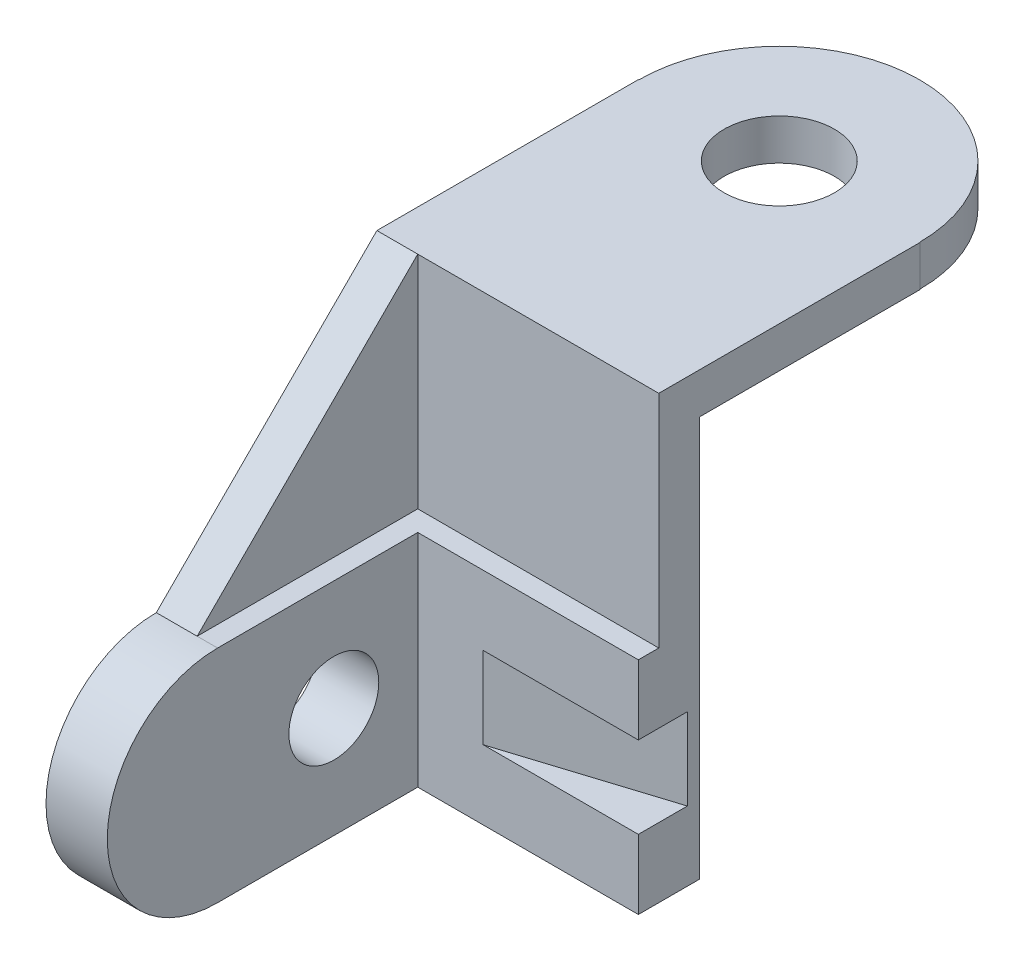
ISO-10303-21;
HEADER;
FILE_DESCRIPTION(('STEP AP214'),'2;1');
FILE_NAME('part.step','',(''),(''),'','','');
FILE_SCHEMA(('AUTOMOTIVE_DESIGN { 1 0 10303 214 1 1 1 1 }'));
ENDSEC;
DATA;
#1=APPLICATION_CONTEXT('core data for automotive mechanical design processes');
#2=APPLICATION_PROTOCOL_DEFINITION('international standard','automotive_design',2000,#1);
#3=PRODUCT_CONTEXT('',#1,'mechanical');
#4=PRODUCT('Part','Part','',(#3));
#5=PRODUCT_RELATED_PRODUCT_CATEGORY('part','',(#4));
#6=PRODUCT_DEFINITION_FORMATION('','',#4);
#7=PRODUCT_DEFINITION_CONTEXT('part definition',#1,'design');
#8=PRODUCT_DEFINITION('design','',#6,#7);
#9=PRODUCT_DEFINITION_SHAPE('','',#8);
#10=(LENGTH_UNIT() NAMED_UNIT(*) SI_UNIT(.MILLI.,.METRE.));
#11=(NAMED_UNIT(*) PLANE_ANGLE_UNIT() SI_UNIT($,.RADIAN.));
#12=(NAMED_UNIT(*) SI_UNIT($,.STERADIAN.) SOLID_ANGLE_UNIT());
#13=UNCERTAINTY_MEASURE_WITH_UNIT(LENGTH_MEASURE(1.E-05),#10,'distance_accuracy_value','');
#14=(GEOMETRIC_REPRESENTATION_CONTEXT(3) GLOBAL_UNCERTAINTY_ASSIGNED_CONTEXT((#13)) GLOBAL_UNIT_ASSIGNED_CONTEXT((#10,
#11,#12)) REPRESENTATION_CONTEXT('',''));
#15=CARTESIAN_POINT('',(0.,0.,0.));
#16=DIRECTION('',(0.,0.,1.));
#17=DIRECTION('',(1.,0.,0.));
#18=AXIS2_PLACEMENT_3D('',#15,#16,#17);
#19=CARTESIAN_POINT('',(31.,-17.,-7.));
#20=DIRECTION('',(0.,1.,0.));
#21=DIRECTION('',(0.,0.,1.));
#22=AXIS2_PLACEMENT_3D('',#19,#20,#21);
#23=PLANE('',#22);
#24=DIRECTION('',(0.953582665134142,0.,-0.301131367937097));
#25=VECTOR('',#24,1.);
#26=CARTESIAN_POINT('',(31.,-17.,5.));
#27=LINE('',#26,#25);
#28=CARTESIAN_POINT('',(31.,-17.,5.));
#29=VERTEX_POINT('',#28);
#30=CARTESIAN_POINT('',(69.,-17.,-7.));
#31=VERTEX_POINT('',#30);
#32=EDGE_CURVE('E170',#29,#31,#27,.T.);
#33=ORIENTED_EDGE('',*,*,#32,.T.);
#34=DIRECTION('',(0.,0.,1.));
#35=VECTOR('',#34,1.);
#36=CARTESIAN_POINT('',(69.,-17.,-7.));
#37=LINE('',#36,#35);
#38=CARTESIAN_POINT('',(69.,-17.,5.));
#39=VERTEX_POINT('',#38);
#40=EDGE_CURVE('E155',#31,#39,#37,.T.);
#41=ORIENTED_EDGE('',*,*,#40,.T.);
#42=DIRECTION('',(-1.,0.,0.));
#43=VECTOR('',#42,1.);
#44=CARTESIAN_POINT('',(31.,-17.,5.));
#45=LINE('',#44,#43);
#46=EDGE_CURVE('E171',#39,#29,#45,.T.);
#47=ORIENTED_EDGE('',*,*,#46,.T.);
#48=EDGE_LOOP('',(#33,#41,#47));
#49=FACE_BOUND('',#48,.T.);
#50=ADVANCED_FACE('F41',(#49),#23,.F.);
#51=CARTESIAN_POINT('',(31.,-37.,-7.));
#52=DIRECTION('',(0.,-1.,0.));
#53=DIRECTION('',(0.,0.,-1.));
#54=AXIS2_PLACEMENT_3D('',#51,#52,#53);
#55=PLANE('',#54);
#56=DIRECTION('',(0.953582665134142,0.,-0.301131367937097));
#57=VECTOR('',#56,1.);
#58=CARTESIAN_POINT('',(31.,-37.,5.));
#59=LINE('',#58,#57);
#60=CARTESIAN_POINT('',(31.,-37.,5.));
#61=VERTEX_POINT('',#60);
#62=CARTESIAN_POINT('',(69.,-37.,-7.));
#63=VERTEX_POINT('',#62);
#64=EDGE_CURVE('E57',#61,#63,#59,.T.);
#65=ORIENTED_EDGE('',*,*,#64,.F.);
#66=DIRECTION('',(1.,0.,0.));
#67=VECTOR('',#66,1.);
#68=CARTESIAN_POINT('',(31.,-37.,5.));
#69=LINE('',#68,#67);
#70=CARTESIAN_POINT('',(69.,-37.,5.));
#71=VERTEX_POINT('',#70);
#72=EDGE_CURVE('E184',#61,#71,#69,.T.);
#73=ORIENTED_EDGE('',*,*,#72,.T.);
#74=DIRECTION('',(0.,0.,1.));
#75=VECTOR('',#74,1.);
#76=CARTESIAN_POINT('',(69.,-37.,-7.));
#77=LINE('',#76,#75);
#78=EDGE_CURVE('E167',#63,#71,#77,.T.);
#79=ORIENTED_EDGE('',*,*,#78,.F.);
#80=EDGE_LOOP('',(#65,#73,#79));
#81=FACE_BOUND('',#80,.T.);
#82=ADVANCED_FACE('F390',(#81),#55,.F.);
#83=CARTESIAN_POINT('',(0.,0.,-64.));
#84=DIRECTION('',(0.,0.,-1.));
#85=DIRECTION('',(-1.,0.,0.));
#86=AXIS2_PLACEMENT_3D('',#83,#84,#85);
#87=PLANE('',#86);
#88=DIRECTION('',(0.,1.,0.));
#89=VECTOR('',#88,1.);
#90=CARTESIAN_POINT('',(0.104882418884351,44.,-64.));
#91=LINE('',#90,#89);
#92=CARTESIAN_POINT('',(0.104882418884351,44.,-64.));
#93=VERTEX_POINT('',#92);
#94=CARTESIAN_POINT('',(0.104882418884351,54.,-64.));
#95=VERTEX_POINT('',#94);
#96=EDGE_CURVE('E11',#93,#95,#91,.T.);
#97=ORIENTED_EDGE('',*,*,#96,.F.);
#98=DIRECTION('',(-1.,0.,0.));
#99=VECTOR('',#98,1.);
#100=CARTESIAN_POINT('',(69.,44.,-64.));
#101=LINE('',#100,#99);
#102=CARTESIAN_POINT('',(0.,44.,-64.));
#103=VERTEX_POINT('',#102);
#104=EDGE_CURVE('E210',#93,#103,#101,.T.);
#105=ORIENTED_EDGE('',*,*,#104,.T.);
#106=DIRECTION('',(0.,1.,0.));
#107=VECTOR('',#106,1.);
#108=CARTESIAN_POINT('',(0.,54.,-64.));
#109=LINE('',#108,#107);
#110=CARTESIAN_POINT('',(0.,54.,-64.));
#111=VERTEX_POINT('',#110);
#112=EDGE_CURVE('E215',#103,#111,#109,.T.);
#113=ORIENTED_EDGE('',*,*,#112,.T.);
#114=DIRECTION('',(1.,0.,0.));
#115=VECTOR('',#114,1.);
#116=CARTESIAN_POINT('',(69.,54.,-64.));
#117=LINE('',#116,#115);
#118=EDGE_CURVE('E220',#111,#95,#117,.T.);
#119=ORIENTED_EDGE('',*,*,#118,.T.);
#120=EDGE_LOOP('',(#97,#105,#113,#119));
#121=FACE_BOUND('',#120,.T.);
#122=ADVANCED_FACE('F365',(#121),#87,.T.);
#123=CARTESIAN_POINT('',(0.,0.,-10.));
#124=DIRECTION('',(0.,0.,1.));
#125=DIRECTION('',(1.,0.,0.));
#126=AXIS2_PLACEMENT_3D('',#123,#124,#125);
#127=PLANE('',#126);
#128=DIRECTION('',(-1.,0.,0.));
#129=VECTOR('',#128,1.);
#130=CARTESIAN_POINT('',(69.,44.,-10.));
#131=LINE('',#130,#129);
#132=CARTESIAN_POINT('',(69.,44.,-10.));
#133=VERTEX_POINT('',#132);
#134=CARTESIAN_POINT('',(0.,44.,-10.));
#135=VERTEX_POINT('',#134);
#136=EDGE_CURVE('E65',#133,#135,#131,.T.);
#137=ORIENTED_EDGE('',*,*,#136,.F.);
#138=DIRECTION('',(0.,1.,0.));
#139=VECTOR('',#138,1.);
#140=CARTESIAN_POINT('',(69.,0.,-10.));
#141=LINE('',#140,#139);
#142=CARTESIAN_POINT('',(69.,-54.,-10.));
#143=VERTEX_POINT('',#142);
#144=EDGE_CURVE('E261',#143,#133,#141,.T.);
#145=ORIENTED_EDGE('',*,*,#144,.F.);
#146=DIRECTION('',(-1.,0.,0.));
#147=VECTOR('',#146,1.);
#148=CARTESIAN_POINT('',(0.,-54.,-10.));
#149=LINE('',#148,#147);
#150=CARTESIAN_POINT('',(0.,-54.,-10.));
#151=VERTEX_POINT('',#150);
#152=EDGE_CURVE('E272',#143,#151,#149,.T.);
#153=ORIENTED_EDGE('',*,*,#152,.T.);
#154=DIRECTION('',(0.,1.,0.));
#155=VECTOR('',#154,1.);
#156=CARTESIAN_POINT('',(0.,54.,-10.));
#157=LINE('',#156,#155);
#158=EDGE_CURVE('E269',#151,#135,#157,.T.);
#159=ORIENTED_EDGE('',*,*,#158,.T.);
#160=EDGE_LOOP('',(#137,#145,#153,#159));
#161=FACE_BOUND('',#160,.T.);
#162=ADVANCED_FACE('F397',(#161),#127,.F.);
#163=CARTESIAN_POINT('',(0.,0.,0.));
#164=DIRECTION('',(0.,0.,1.));
#165=DIRECTION('',(1.,0.,0.));
#166=AXIS2_PLACEMENT_3D('',#163,#164,#165);
#167=PLANE('',#166);
#168=DIRECTION('',(-1.,0.,0.));
#169=VECTOR('',#168,1.);
#170=CARTESIAN_POINT('',(15.,0.,0.));
#171=LINE('',#170,#169);
#172=CARTESIAN_POINT('',(69.,0.,0.));
#173=VERTEX_POINT('',#172);
#174=CARTESIAN_POINT('',(10.,0.,0.));
#175=VERTEX_POINT('',#174);
#176=EDGE_CURVE('E298',#173,#175,#171,.T.);
#177=ORIENTED_EDGE('',*,*,#176,.F.);
#178=DIRECTION('',(0.,-1.,0.));
#179=VECTOR('',#178,1.);
#180=CARTESIAN_POINT('',(69.,0.,0.));
#181=LINE('',#180,#179);
#182=CARTESIAN_POINT('',(69.,54.,0.));
#183=VERTEX_POINT('',#182);
#184=EDGE_CURVE('E253',#183,#173,#181,.T.);
#185=ORIENTED_EDGE('',*,*,#184,.F.);
#186=DIRECTION('',(1.,0.,0.));
#187=VECTOR('',#186,1.);
#188=CARTESIAN_POINT('',(0.,54.,0.));
#189=LINE('',#188,#187);
#190=CARTESIAN_POINT('',(10.,54.,0.));
#191=VERTEX_POINT('',#190);
#192=EDGE_CURVE('E268',#191,#183,#189,.T.);
#193=ORIENTED_EDGE('',*,*,#192,.F.);
#194=DIRECTION('',(0.,1.,0.));
#195=VECTOR('',#194,1.);
#196=CARTESIAN_POINT('',(10.,0.,0.));
#197=LINE('',#196,#195);
#198=EDGE_CURVE('E327',#175,#191,#197,.T.);
#199=ORIENTED_EDGE('',*,*,#198,.F.);
#200=EDGE_LOOP('',(#177,#185,#193,#199));
#201=FACE_BOUND('',#200,.T.);
#202=ADVANCED_FACE('F417',(#201),#167,.T.);
#203=CARTESIAN_POINT('',(10.,27.,27.));
#204=DIRECTION('',(0.,-0.707106781186548,-0.707106781186548));
#205=DIRECTION('',(0.,0.707106781186548,-0.707106781186548));
#206=AXIS2_PLACEMENT_3D('',#203,#204,#205);
#207=PLANE('',#206);
#208=DIRECTION('',(0.,-0.707106781186548,0.707106781186548));
#209=VECTOR('',#208,1.);
#210=CARTESIAN_POINT('',(0.,27.,27.));
#211=LINE('',#210,#209);
#212=CARTESIAN_POINT('',(0.,54.,0.));
#213=VERTEX_POINT('',#212);
#214=CARTESIAN_POINT('',(0.,0.,54.));
#215=VERTEX_POINT('',#214);
#216=EDGE_CURVE('E319',#213,#215,#211,.T.);
#217=ORIENTED_EDGE('',*,*,#216,.T.);
#218=DIRECTION('',(-1.,0.,0.));
#219=VECTOR('',#218,1.);
#220=CARTESIAN_POINT('',(10.,0.,54.));
#221=LINE('',#220,#219);
#222=CARTESIAN_POINT('',(10.,0.,54.));
#223=VERTEX_POINT('',#222);
#224=EDGE_CURVE('E337',#223,#215,#221,.T.);
#225=ORIENTED_EDGE('',*,*,#224,.F.);
#226=DIRECTION('',(0.,-0.707106781186548,0.707106781186548));
#227=VECTOR('',#226,1.);
#228=CARTESIAN_POINT('',(10.,27.,27.));
#229=LINE('',#228,#227);
#230=EDGE_CURVE('E320',#191,#223,#229,.T.);
#231=ORIENTED_EDGE('',*,*,#230,.F.);
#232=DIRECTION('',(-1.,0.,0.));
#233=VECTOR('',#232,1.);
#234=CARTESIAN_POINT('',(10.,54.,0.));
#235=LINE('',#234,#233);
#236=EDGE_CURVE('E331',#191,#213,#235,.T.);
#237=ORIENTED_EDGE('',*,*,#236,.T.);
#238=EDGE_LOOP('',(#217,#225,#231,#237));
#239=FACE_BOUND('',#238,.T.);
#240=ADVANCED_FACE('F43',(#239),#207,.F.);
#241=CARTESIAN_POINT('',(10.,0.,0.));
#242=DIRECTION('',(1.,0.,0.));
#243=DIRECTION('',(0.,0.,-1.));
#244=AXIS2_PLACEMENT_3D('',#241,#242,#243);
#245=PLANE('',#244);
#246=ORIENTED_EDGE('',*,*,#230,.T.);
#247=DIRECTION('',(0.,0.,-1.));
#248=VECTOR('',#247,1.);
#249=CARTESIAN_POINT('',(10.,0.,0.));
#250=LINE('',#249,#248);
#251=EDGE_CURVE('E323',#223,#175,#250,.T.);
#252=ORIENTED_EDGE('',*,*,#251,.T.);
#253=ORIENTED_EDGE('',*,*,#198,.T.);
#254=EDGE_LOOP('',(#246,#252,#253));
#255=FACE_BOUND('',#254,.T.);
#256=ADVANCED_FACE('F438',(#255),#245,.T.);
#257=CARTESIAN_POINT('',(0.,0.,0.));
#258=DIRECTION('',(1.,0.,0.));
#259=DIRECTION('',(0.,0.,-1.));
#260=AXIS2_PLACEMENT_3D('',#257,#258,#259);
#261=PLANE('',#260);
#262=ORIENTED_EDGE('',*,*,#216,.F.);
#263=DIRECTION('',(0.,0.,1.));
#264=VECTOR('',#263,1.);
#265=CARTESIAN_POINT('',(0.,54.,-10.));
#266=LINE('',#265,#264);
#267=EDGE_CURVE('E276',#111,#213,#266,.T.);
#268=ORIENTED_EDGE('',*,*,#267,.F.);
#269=ORIENTED_EDGE('',*,*,#112,.F.);
#270=DIRECTION('',(0.,0.,1.));
#271=VECTOR('',#270,1.);
#272=CARTESIAN_POINT('',(0.,44.,-64.));
#273=LINE('',#272,#271);
#274=EDGE_CURVE('E224',#103,#135,#273,.T.);
#275=ORIENTED_EDGE('',*,*,#274,.T.);
#276=ORIENTED_EDGE('',*,*,#158,.F.);
#277=DIRECTION('',(0.,0.,1.));
#278=VECTOR('',#277,1.);
#279=CARTESIAN_POINT('',(0.,-54.,0.));
#280=LINE('',#279,#278);
#281=CARTESIAN_POINT('',(0.,-54.,54.));
#282=VERTEX_POINT('',#281);
#283=EDGE_CURVE('E287',#151,#282,#280,.T.);
#284=ORIENTED_EDGE('',*,*,#283,.T.);
#285=CARTESIAN_POINT('',(0.,-27.,54.));
#286=DIRECTION('',(1.,0.,0.));
#287=DIRECTION('',(0.,0.,-1.));
#288=AXIS2_PLACEMENT_3D('',#285,#286,#287);
#289=CIRCLE('',#288,27.);
#290=EDGE_CURVE('E302',#215,#282,#289,.T.);
#291=ORIENTED_EDGE('',*,*,#290,.F.);
#292=EDGE_LOOP('',(#262,#268,#269,#275,#276,#284,#291));
#293=FACE_BOUND('',#292,.T.);
#294=CARTESIAN_POINT('',(0.,-27.,25.5451008824851));
#295=DIRECTION('',(1.,0.,0.));
#296=DIRECTION('',(0.,0.,-1.));
#297=AXIS2_PLACEMENT_3D('',#294,#295,#296);
#298=CIRCLE('',#297,11.);
#299=CARTESIAN_POINT('',(0.,-27.,14.5451008824851));
#300=VERTEX_POINT('',#299);
#301=EDGE_CURVE('E281',#300,#300,#298,.T.);
#302=ORIENTED_EDGE('',*,*,#301,.T.);
#303=EDGE_LOOP('',(#302));
#304=FACE_BOUND('',#303,.T.);
#305=ADVANCED_FACE('F361',(#293,#304),#261,.F.);
#306=CARTESIAN_POINT('',(15.,0.,0.));
#307=DIRECTION('',(0.,1.,0.));
#308=DIRECTION('',(0.,0.,1.));
#309=AXIS2_PLACEMENT_3D('',#306,#307,#308);
#310=PLANE('',#309);
#311=ORIENTED_EDGE('',*,*,#176,.T.);
#312=ORIENTED_EDGE('',*,*,#251,.F.);
#313=DIRECTION('',(-1.,0.,0.));
#314=VECTOR('',#313,1.);
#315=CARTESIAN_POINT('',(15.,0.,54.));
#316=LINE('',#315,#314);
#317=CARTESIAN_POINT('',(15.,0.,54.));
#318=VERTEX_POINT('',#317);
#319=EDGE_CURVE('E315',#318,#223,#316,.T.);
#320=ORIENTED_EDGE('',*,*,#319,.F.);
#321=DIRECTION('',(0.,0.,-1.));
#322=VECTOR('',#321,1.);
#323=CARTESIAN_POINT('',(15.,0.,0.));
#324=LINE('',#323,#322);
#325=CARTESIAN_POINT('',(15.,0.,5.));
#326=VERTEX_POINT('',#325);
#327=EDGE_CURVE('E286',#318,#326,#324,.T.);
#328=ORIENTED_EDGE('',*,*,#327,.T.);
#329=DIRECTION('',(-1.,0.,0.));
#330=VECTOR('',#329,1.);
#331=CARTESIAN_POINT('',(15.,0.,5.));
#332=LINE('',#331,#330);
#333=CARTESIAN_POINT('',(69.,0.,5.));
#334=VERTEX_POINT('',#333);
#335=EDGE_CURVE('E246',#334,#326,#332,.T.);
#336=ORIENTED_EDGE('',*,*,#335,.F.);
#337=DIRECTION('',(0.,0.,-1.));
#338=VECTOR('',#337,1.);
#339=CARTESIAN_POINT('',(69.,0.,5.));
#340=LINE('',#339,#338);
#341=EDGE_CURVE('E249',#334,#173,#340,.T.);
#342=ORIENTED_EDGE('',*,*,#341,.T.);
#343=EDGE_LOOP('',(#311,#312,#320,#328,#336,#342));
#344=FACE_BOUND('',#343,.T.);
#345=ADVANCED_FACE('F379',(#344),#310,.T.);
#346=CARTESIAN_POINT('',(15.,-27.,54.));
#347=DIRECTION('',(-1.,0.,0.));
#348=DIRECTION('',(0.,0.,1.));
#349=AXIS2_PLACEMENT_3D('',#346,#347,#348);
#350=CYLINDRICAL_SURFACE('',#349,27.);
#351=ORIENTED_EDGE('',*,*,#290,.T.);
#352=DIRECTION('',(-1.,0.,0.));
#353=VECTOR('',#352,1.);
#354=CARTESIAN_POINT('',(15.,-54.,54.));
#355=LINE('',#354,#353);
#356=CARTESIAN_POINT('',(15.,-54.,54.));
#357=VERTEX_POINT('',#356);
#358=EDGE_CURVE('E312',#357,#282,#355,.T.);
#359=ORIENTED_EDGE('',*,*,#358,.F.);
#360=CARTESIAN_POINT('',(15.,-27.,54.));
#361=DIRECTION('',(1.,0.,0.));
#362=DIRECTION('',(0.,0.,-1.));
#363=AXIS2_PLACEMENT_3D('',#360,#361,#362);
#364=CIRCLE('',#363,27.);
#365=EDGE_CURVE('E291',#318,#357,#364,.T.);
#366=ORIENTED_EDGE('',*,*,#365,.F.);
#367=ORIENTED_EDGE('',*,*,#319,.T.);
#368=ORIENTED_EDGE('',*,*,#224,.T.);
#369=EDGE_LOOP('',(#351,#359,#366,#367,#368));
#370=FACE_BOUND('',#369,.T.);
#371=ADVANCED_FACE('F429',(#370),#350,.T.);
#372=CARTESIAN_POINT('',(15.,-54.,0.));
#373=DIRECTION('',(0.,-1.,0.));
#374=DIRECTION('',(0.,0.,-1.));
#375=AXIS2_PLACEMENT_3D('',#372,#373,#374);
#376=PLANE('',#375);
#377=DIRECTION('',(1.,0.,0.));
#378=VECTOR('',#377,1.);
#379=CARTESIAN_POINT('',(15.,-54.,5.));
#380=LINE('',#379,#378);
#381=CARTESIAN_POINT('',(15.,-54.,5.));
#382=VERTEX_POINT('',#381);
#383=CARTESIAN_POINT('',(69.,-54.,5.));
#384=VERTEX_POINT('',#383);
#385=EDGE_CURVE('E238',#382,#384,#380,.T.);
#386=ORIENTED_EDGE('',*,*,#385,.F.);
#387=DIRECTION('',(0.,0.,1.));
#388=VECTOR('',#387,1.);
#389=CARTESIAN_POINT('',(15.,-54.,0.));
#390=LINE('',#389,#388);
#391=EDGE_CURVE('E295',#382,#357,#390,.T.);
#392=ORIENTED_EDGE('',*,*,#391,.T.);
#393=ORIENTED_EDGE('',*,*,#358,.T.);
#394=ORIENTED_EDGE('',*,*,#283,.F.);
#395=ORIENTED_EDGE('',*,*,#152,.F.);
#396=DIRECTION('',(0.,0.,-1.));
#397=VECTOR('',#396,1.);
#398=CARTESIAN_POINT('',(69.,-54.,0.));
#399=LINE('',#398,#397);
#400=EDGE_CURVE('E257',#384,#143,#399,.T.);
#401=ORIENTED_EDGE('',*,*,#400,.F.);
#402=EDGE_LOOP('',(#386,#392,#393,#394,#395,#401));
#403=FACE_BOUND('',#402,.T.);
#404=ADVANCED_FACE('F426',(#403),#376,.T.);
#405=CARTESIAN_POINT('',(15.,-27.,25.5451008824851));
#406=DIRECTION('',(-1.,0.,0.));
#407=DIRECTION('',(0.,0.,1.));
#408=AXIS2_PLACEMENT_3D('',#405,#406,#407);
#409=CYLINDRICAL_SURFACE('',#408,11.);
#410=CARTESIAN_POINT('',(15.,-27.,25.5451008824851));
#411=DIRECTION('',(1.,0.,0.));
#412=DIRECTION('',(0.,0.,-1.));
#413=AXIS2_PLACEMENT_3D('',#410,#411,#412);
#414=CIRCLE('',#413,11.);
#415=CARTESIAN_POINT('',(15.,-27.,14.5451008824851));
#416=VERTEX_POINT('',#415);
#417=EDGE_CURVE('E282',#416,#416,#414,.T.);
#418=ORIENTED_EDGE('',*,*,#417,.T.);
#419=EDGE_LOOP('',(#418));
#420=FACE_BOUND('',#419,.T.);
#421=ORIENTED_EDGE('',*,*,#301,.F.);
#422=EDGE_LOOP('',(#421));
#423=FACE_BOUND('',#422,.T.);
#424=ADVANCED_FACE('F425',(#420,#423),#409,.F.);
#425=CARTESIAN_POINT('',(15.,0.,0.));
#426=DIRECTION('',(1.,0.,0.));
#427=DIRECTION('',(0.,0.,-1.));
#428=AXIS2_PLACEMENT_3D('',#425,#426,#427);
#429=PLANE('',#428);
#430=DIRECTION('',(0.,-1.,0.));
#431=VECTOR('',#430,1.);
#432=CARTESIAN_POINT('',(15.,0.,5.));
#433=LINE('',#432,#431);
#434=EDGE_CURVE('E234',#326,#382,#433,.T.);
#435=ORIENTED_EDGE('',*,*,#434,.F.);
#436=ORIENTED_EDGE('',*,*,#327,.F.);
#437=ORIENTED_EDGE('',*,*,#365,.T.);
#438=ORIENTED_EDGE('',*,*,#391,.F.);
#439=EDGE_LOOP('',(#435,#436,#437,#438));
#440=FACE_BOUND('',#439,.T.);
#441=ORIENTED_EDGE('',*,*,#417,.F.);
#442=EDGE_LOOP('',(#441));
#443=FACE_BOUND('',#442,.T.);
#444=ADVANCED_FACE('F384',(#440,#443),#429,.T.);
#445=CARTESIAN_POINT('',(0.,54.,-10.));
#446=DIRECTION('',(0.,-1.,0.));
#447=DIRECTION('',(0.,0.,-1.));
#448=AXIS2_PLACEMENT_3D('',#445,#446,#447);
#449=PLANE('',#448);
#450=CARTESIAN_POINT('',(68.8951175811157,54.,-64.));
#451=VERTEX_POINT('',#450);
#452=CARTESIAN_POINT('',(69.,54.,-64.));
#453=VERTEX_POINT('',#452);
#454=EDGE_CURVE('E219',#451,#453,#117,.T.);
#455=ORIENTED_EDGE('',*,*,#454,.F.);
#456=CARTESIAN_POINT('',(34.5,54.,-64.));
#457=DIRECTION('',(0.,1.,0.));
#458=DIRECTION('',(0.,0.,1.));
#459=AXIS2_PLACEMENT_3D('',#456,#457,#458);
#460=CIRCLE('',#459,34.3951175811156);
#461=EDGE_CURVE('E196',#451,#95,#460,.T.);
#462=ORIENTED_EDGE('',*,*,#461,.T.);
#463=ORIENTED_EDGE('',*,*,#118,.F.);
#464=ORIENTED_EDGE('',*,*,#267,.T.);
#465=ORIENTED_EDGE('',*,*,#236,.F.);
#466=ORIENTED_EDGE('',*,*,#192,.T.);
#467=DIRECTION('',(0.,0.,1.));
#468=VECTOR('',#467,1.);
#469=CARTESIAN_POINT('',(69.,54.,0.));
#470=LINE('',#469,#468);
#471=EDGE_CURVE('E264',#453,#183,#470,.T.);
#472=ORIENTED_EDGE('',*,*,#471,.F.);
#473=EDGE_LOOP('',(#455,#462,#463,#464,#465,#466,#472));
#474=FACE_BOUND('',#473,.T.);
#475=CARTESIAN_POINT('',(34.5,54.,-64.));
#476=DIRECTION('',(0.,1.,0.));
#477=DIRECTION('',(0.,0.,1.));
#478=AXIS2_PLACEMENT_3D('',#475,#476,#477);
#479=CIRCLE('',#478,13.5);
#480=CARTESIAN_POINT('',(34.5,54.,-50.5));
#481=VERTEX_POINT('',#480);
#482=EDGE_CURVE('E166',#481,#481,#479,.T.);
#483=ORIENTED_EDGE('',*,*,#482,.F.);
#484=EDGE_LOOP('',(#483));
#485=FACE_BOUND('',#484,.T.);
#486=ADVANCED_FACE('F367',(#474,#485),#449,.F.);
#487=CARTESIAN_POINT('',(69.,0.,0.));
#488=DIRECTION('',(1.,0.,0.));
#489=DIRECTION('',(0.,0.,-1.));
#490=AXIS2_PLACEMENT_3D('',#487,#488,#489);
#491=PLANE('',#490);
#492=ORIENTED_EDGE('',*,*,#40,.F.);
#493=DIRECTION('',(0.,1.,0.));
#494=VECTOR('',#493,1.);
#495=CARTESIAN_POINT('',(69.,-17.,-7.));
#496=LINE('',#495,#494);
#497=EDGE_CURVE('E160',#63,#31,#496,.T.);
#498=ORIENTED_EDGE('',*,*,#497,.F.);
#499=ORIENTED_EDGE('',*,*,#78,.T.);
#500=DIRECTION('',(0.,1.,0.));
#501=VECTOR('',#500,1.);
#502=CARTESIAN_POINT('',(69.,0.,5.));
#503=LINE('',#502,#501);
#504=EDGE_CURVE('E242',#384,#71,#503,.T.);
#505=ORIENTED_EDGE('',*,*,#504,.F.);
#506=ORIENTED_EDGE('',*,*,#400,.T.);
#507=ORIENTED_EDGE('',*,*,#144,.T.);
#508=DIRECTION('',(0.,0.,1.));
#509=VECTOR('',#508,1.);
#510=CARTESIAN_POINT('',(69.,44.,-64.));
#511=LINE('',#510,#509);
#512=CARTESIAN_POINT('',(69.,44.,-64.));
#513=VERTEX_POINT('',#512);
#514=EDGE_CURVE('E230',#513,#133,#511,.T.);
#515=ORIENTED_EDGE('',*,*,#514,.F.);
#516=DIRECTION('',(0.,-1.,0.));
#517=VECTOR('',#516,1.);
#518=CARTESIAN_POINT('',(69.,54.,-64.));
#519=LINE('',#518,#517);
#520=EDGE_CURVE('E206',#453,#513,#519,.T.);
#521=ORIENTED_EDGE('',*,*,#520,.F.);
#522=ORIENTED_EDGE('',*,*,#471,.T.);
#523=ORIENTED_EDGE('',*,*,#184,.T.);
#524=ORIENTED_EDGE('',*,*,#341,.F.);
#525=EDGE_CURVE('E162',#39,#334,#503,.T.);
#526=ORIENTED_EDGE('',*,*,#525,.F.);
#527=EDGE_LOOP('',(#492,#498,#499,#505,#506,#507,#515,#521,#522,#523,#524,#526));
#528=FACE_BOUND('',#527,.T.);
#529=ADVANCED_FACE('F157',(#528),#491,.T.);
#530=CARTESIAN_POINT('',(0.,0.,5.));
#531=DIRECTION('',(0.,0.,1.));
#532=DIRECTION('',(1.,0.,0.));
#533=AXIS2_PLACEMENT_3D('',#530,#531,#532);
#534=PLANE('',#533);
#535=ORIENTED_EDGE('',*,*,#46,.F.);
#536=ORIENTED_EDGE('',*,*,#525,.T.);
#537=ORIENTED_EDGE('',*,*,#335,.T.);
#538=ORIENTED_EDGE('',*,*,#434,.T.);
#539=ORIENTED_EDGE('',*,*,#385,.T.);
#540=ORIENTED_EDGE('',*,*,#504,.T.);
#541=ORIENTED_EDGE('',*,*,#72,.F.);
#542=DIRECTION('',(0.,-1.,0.));
#543=VECTOR('',#542,1.);
#544=CARTESIAN_POINT('',(31.,-17.,5.));
#545=LINE('',#544,#543);
#546=EDGE_CURVE('E176',#29,#61,#545,.T.);
#547=ORIENTED_EDGE('',*,*,#546,.F.);
#548=EDGE_LOOP('',(#535,#536,#537,#538,#539,#540,#541,#547));
#549=FACE_BOUND('',#548,.T.);
#550=ADVANCED_FACE('F374',(#549),#534,.T.);
#551=CARTESIAN_POINT('',(69.,44.,-64.));
#552=DIRECTION('',(0.,1.,0.));
#553=DIRECTION('',(0.,0.,1.));
#554=AXIS2_PLACEMENT_3D('',#551,#552,#553);
#555=PLANE('',#554);
#556=ORIENTED_EDGE('',*,*,#104,.F.);
#557=CARTESIAN_POINT('',(34.5,44.,-64.));
#558=DIRECTION('',(0.,1.,0.));
#559=DIRECTION('',(0.,0.,1.));
#560=AXIS2_PLACEMENT_3D('',#557,#558,#559);
#561=CIRCLE('',#560,34.3951175811156);
#562=CARTESIAN_POINT('',(68.8951175811157,44.,-64.));
#563=VERTEX_POINT('',#562);
#564=EDGE_CURVE('E200',#563,#93,#561,.T.);
#565=ORIENTED_EDGE('',*,*,#564,.F.);
#566=EDGE_CURVE('E211',#513,#563,#101,.T.);
#567=ORIENTED_EDGE('',*,*,#566,.F.);
#568=ORIENTED_EDGE('',*,*,#514,.T.);
#569=ORIENTED_EDGE('',*,*,#136,.T.);
#570=ORIENTED_EDGE('',*,*,#274,.F.);
#571=EDGE_LOOP('',(#556,#565,#567,#568,#569,#570));
#572=FACE_BOUND('',#571,.T.);
#573=CARTESIAN_POINT('',(34.5,44.,-64.));
#574=DIRECTION('',(0.,1.,0.));
#575=DIRECTION('',(0.,0.,1.));
#576=AXIS2_PLACEMENT_3D('',#573,#574,#575);
#577=CIRCLE('',#576,13.5);
#578=CARTESIAN_POINT('',(34.5,44.,-50.5));
#579=VERTEX_POINT('',#578);
#580=EDGE_CURVE('E192',#579,#579,#577,.T.);
#581=ORIENTED_EDGE('',*,*,#580,.T.);
#582=EDGE_LOOP('',(#581));
#583=FACE_BOUND('',#582,.T.);
#584=ADVANCED_FACE('F350',(#572,#583),#555,.F.);
#585=DIRECTION('',(0.,1.,0.));
#586=VECTOR('',#585,1.);
#587=CARTESIAN_POINT('',(68.8951175811157,44.,-64.));
#588=LINE('',#587,#586);
#589=EDGE_CURVE('E50',#451,#563,#588,.F.);
#590=ORIENTED_EDGE('',*,*,#589,.F.);
#591=ORIENTED_EDGE('',*,*,#454,.T.);
#592=ORIENTED_EDGE('',*,*,#520,.T.);
#593=ORIENTED_EDGE('',*,*,#566,.T.);
#594=EDGE_LOOP('',(#590,#591,#592,#593));
#595=FACE_BOUND('',#594,.T.);
#596=ADVANCED_FACE('F353',(#595),#87,.T.);
#597=CARTESIAN_POINT('',(34.5,44.,-64.));
#598=DIRECTION('',(0.,1.,0.));
#599=DIRECTION('',(0.,0.,1.));
#600=AXIS2_PLACEMENT_3D('',#597,#598,#599);
#601=CYLINDRICAL_SURFACE('',#600,34.3951175811156);
#602=ORIENTED_EDGE('',*,*,#564,.T.);
#603=ORIENTED_EDGE('',*,*,#96,.T.);
#604=ORIENTED_EDGE('',*,*,#461,.F.);
#605=ORIENTED_EDGE('',*,*,#589,.T.);
#606=EDGE_LOOP('',(#602,#603,#604,#605));
#607=FACE_BOUND('',#606,.T.);
#608=ADVANCED_FACE('F344',(#607),#601,.T.);
#609=CARTESIAN_POINT('',(34.5,44.,-64.));
#610=DIRECTION('',(0.,1.,0.));
#611=DIRECTION('',(0.,0.,1.));
#612=AXIS2_PLACEMENT_3D('',#609,#610,#611);
#613=CYLINDRICAL_SURFACE('',#612,13.5);
#614=ORIENTED_EDGE('',*,*,#482,.T.);
#615=EDGE_LOOP('',(#614));
#616=FACE_BOUND('',#615,.T.);
#617=ORIENTED_EDGE('',*,*,#580,.F.);
#618=EDGE_LOOP('',(#617));
#619=FACE_BOUND('',#618,.T.);
#620=ADVANCED_FACE('F402',(#616,#619),#613,.F.);
#621=CARTESIAN_POINT('',(31.,-17.,5.));
#622=DIRECTION('',(-0.301131367937097,0.,-0.953582665134141));
#623=DIRECTION('',(-0.953582665134142,0.,0.301131367937097));
#624=AXIS2_PLACEMENT_3D('',#621,#622,#623);
#625=PLANE('',#624);
#626=ORIENTED_EDGE('',*,*,#64,.T.);
#627=ORIENTED_EDGE('',*,*,#497,.T.);
#628=ORIENTED_EDGE('',*,*,#32,.F.);
#629=ORIENTED_EDGE('',*,*,#546,.T.);
#630=EDGE_LOOP('',(#626,#627,#628,#629));
#631=FACE_BOUND('',#630,.T.);
#632=ADVANCED_FACE('F178',(#631),#625,.F.);
#633=CLOSED_SHELL('',(#50,#82,#122,#162,#202,#240,#256,#305,#345,#371,#404,#424,#444,#486,#529,
#550,#584,#596,#608,#620,#632));
#634=MANIFOLD_SOLID_BREP('B2',#633);
#635=ADVANCED_BREP_SHAPE_REPRESENTATION('',(#18,#634),#14);
#636=SHAPE_DEFINITION_REPRESENTATION(#9,#635);
ENDSEC;
END-ISO-10303-21;
